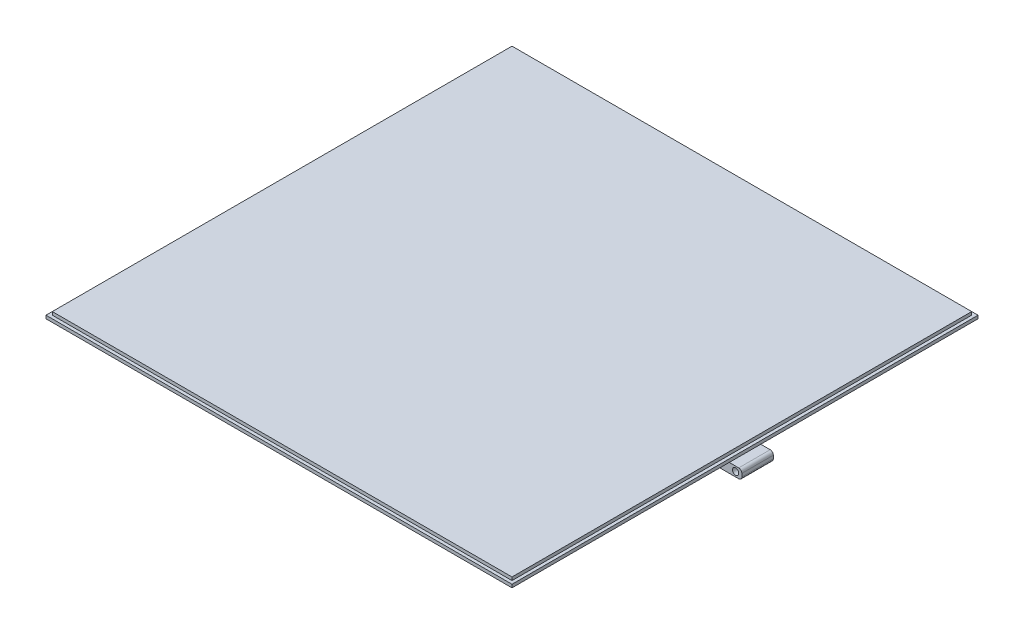
ISO-10303-21;
HEADER;
FILE_DESCRIPTION(('STEP AP214'),'2;1');
FILE_NAME('part.step','',(''),(''),'','','');
FILE_SCHEMA(('AUTOMOTIVE_DESIGN { 1 0 10303 214 1 1 1 1 }'));
ENDSEC;
DATA;
#1=APPLICATION_CONTEXT('core data for automotive mechanical design processes');
#2=APPLICATION_PROTOCOL_DEFINITION('international standard','automotive_design',2000,#1);
#3=PRODUCT_CONTEXT('',#1,'mechanical');
#4=PRODUCT('Part','Part','',(#3));
#5=PRODUCT_RELATED_PRODUCT_CATEGORY('part','',(#4));
#6=PRODUCT_DEFINITION_FORMATION('','',#4);
#7=PRODUCT_DEFINITION_CONTEXT('part definition',#1,'design');
#8=PRODUCT_DEFINITION('design','',#6,#7);
#9=PRODUCT_DEFINITION_SHAPE('','',#8);
#10=(LENGTH_UNIT() NAMED_UNIT(*) SI_UNIT(.MILLI.,.METRE.));
#11=(NAMED_UNIT(*) PLANE_ANGLE_UNIT() SI_UNIT($,.RADIAN.));
#12=(NAMED_UNIT(*) SI_UNIT($,.STERADIAN.) SOLID_ANGLE_UNIT());
#13=UNCERTAINTY_MEASURE_WITH_UNIT(LENGTH_MEASURE(1.E-05),#10,'distance_accuracy_value','');
#14=(GEOMETRIC_REPRESENTATION_CONTEXT(3) GLOBAL_UNCERTAINTY_ASSIGNED_CONTEXT((#13)) GLOBAL_UNIT_ASSIGNED_CONTEXT((#10,
#11,#12)) REPRESENTATION_CONTEXT('',''));
#15=CARTESIAN_POINT('',(0.,0.,0.));
#16=DIRECTION('',(0.,0.,1.));
#17=DIRECTION('',(1.,0.,0.));
#18=AXIS2_PLACEMENT_3D('',#15,#16,#17);
#19=CARTESIAN_POINT('',(0.,26.,0.));
#20=DIRECTION('',(0.,-1.,0.));
#21=DIRECTION('',(0.,0.,-1.));
#22=AXIS2_PLACEMENT_3D('',#19,#20,#21);
#23=PLANE('',#22);
#24=DIRECTION('',(0.,0.,-1.));
#25=VECTOR('',#24,1.);
#26=CARTESIAN_POINT('',(-74.,26.,74.));
#27=LINE('',#26,#25);
#28=CARTESIAN_POINT('',(-74.,26.,74.));
#29=VERTEX_POINT('',#28);
#30=CARTESIAN_POINT('',(-74.,26.,-74.));
#31=VERTEX_POINT('',#30);
#32=EDGE_CURVE('E198',#29,#31,#27,.T.);
#33=ORIENTED_EDGE('',*,*,#32,.F.);
#34=DIRECTION('',(-1.,0.,0.));
#35=VECTOR('',#34,1.);
#36=CARTESIAN_POINT('',(-74.,26.,74.));
#37=LINE('',#36,#35);
#38=CARTESIAN_POINT('',(74.,26.,74.));
#39=VERTEX_POINT('',#38);
#40=EDGE_CURVE('E208',#39,#29,#37,.T.);
#41=ORIENTED_EDGE('',*,*,#40,.F.);
#42=DIRECTION('',(0.,0.,1.));
#43=VECTOR('',#42,1.);
#44=CARTESIAN_POINT('',(74.,26.,74.));
#45=LINE('',#44,#43);
#46=CARTESIAN_POINT('',(74.,26.,-74.));
#47=VERTEX_POINT('',#46);
#48=EDGE_CURVE('E205',#47,#39,#45,.T.);
#49=ORIENTED_EDGE('',*,*,#48,.F.);
#50=DIRECTION('',(1.,0.,0.));
#51=VECTOR('',#50,1.);
#52=CARTESIAN_POINT('',(-74.,26.,-74.));
#53=LINE('',#52,#51);
#54=EDGE_CURVE('E201',#31,#47,#53,.T.);
#55=ORIENTED_EDGE('',*,*,#54,.F.);
#56=EDGE_LOOP('',(#33,#41,#49,#55));
#57=FACE_BOUND('',#56,.T.);
#58=DIRECTION('',(-1.,0.,0.));
#59=VECTOR('',#58,1.);
#60=CARTESIAN_POINT('',(73.,26.,73.));
#61=LINE('',#60,#59);
#62=CARTESIAN_POINT('',(73.,26.,73.));
#63=VERTEX_POINT('',#62);
#64=CARTESIAN_POINT('',(-73.,26.,73.));
#65=VERTEX_POINT('',#64);
#66=EDGE_CURVE('E232',#63,#65,#61,.T.);
#67=ORIENTED_EDGE('',*,*,#66,.T.);
#68=DIRECTION('',(0.,0.,-1.));
#69=VECTOR('',#68,1.);
#70=CARTESIAN_POINT('',(-73.,26.,73.));
#71=LINE('',#70,#69);
#72=CARTESIAN_POINT('',(-73.,26.,-73.));
#73=VERTEX_POINT('',#72);
#74=EDGE_CURVE('E235',#65,#73,#71,.T.);
#75=ORIENTED_EDGE('',*,*,#74,.T.);
#76=DIRECTION('',(1.,0.,0.));
#77=VECTOR('',#76,1.);
#78=CARTESIAN_POINT('',(73.,26.,-73.));
#79=LINE('',#78,#77);
#80=CARTESIAN_POINT('',(73.,26.,-73.));
#81=VERTEX_POINT('',#80);
#82=EDGE_CURVE('E258',#73,#81,#79,.T.);
#83=ORIENTED_EDGE('',*,*,#82,.T.);
#84=DIRECTION('',(0.,0.,1.));
#85=VECTOR('',#84,1.);
#86=CARTESIAN_POINT('',(73.,26.,73.));
#87=LINE('',#86,#85);
#88=EDGE_CURVE('E223',#81,#63,#87,.T.);
#89=ORIENTED_EDGE('',*,*,#88,.T.);
#90=EDGE_LOOP('',(#67,#75,#83,#89));
#91=FACE_BOUND('',#90,.T.);
#92=ADVANCED_FACE('F57',(#57,#91),#23,.F.);
#93=CARTESIAN_POINT('',(-74.,26.,74.));
#94=DIRECTION('',(-1.,0.,0.));
#95=DIRECTION('',(0.,0.,1.));
#96=AXIS2_PLACEMENT_3D('',#93,#94,#95);
#97=PLANE('',#96);
#98=DIRECTION('',(0.,0.,-1.));
#99=VECTOR('',#98,1.);
#100=CARTESIAN_POINT('',(-74.,25.,74.));
#101=LINE('',#100,#99);
#102=CARTESIAN_POINT('',(-74.,25.,74.));
#103=VERTEX_POINT('',#102);
#104=CARTESIAN_POINT('',(-74.,25.,-74.));
#105=VERTEX_POINT('',#104);
#106=EDGE_CURVE('E188',#103,#105,#101,.T.);
#107=ORIENTED_EDGE('',*,*,#106,.F.);
#108=DIRECTION('',(0.,-1.,0.));
#109=VECTOR('',#108,1.);
#110=CARTESIAN_POINT('',(-74.,26.,74.));
#111=LINE('',#110,#109);
#112=EDGE_CURVE('E221',#29,#103,#111,.T.);
#113=ORIENTED_EDGE('',*,*,#112,.F.);
#114=ORIENTED_EDGE('',*,*,#32,.T.);
#115=DIRECTION('',(0.,-1.,0.));
#116=VECTOR('',#115,1.);
#117=CARTESIAN_POINT('',(-74.,26.,-74.));
#118=LINE('',#117,#116);
#119=EDGE_CURVE('E210',#31,#105,#118,.T.);
#120=ORIENTED_EDGE('',*,*,#119,.T.);
#121=EDGE_LOOP('',(#107,#113,#114,#120));
#122=FACE_BOUND('',#121,.T.);
#123=ADVANCED_FACE('F314',(#122),#97,.T.);
#124=CARTESIAN_POINT('',(-74.,26.,74.));
#125=DIRECTION('',(0.,0.,1.));
#126=DIRECTION('',(1.,0.,0.));
#127=AXIS2_PLACEMENT_3D('',#124,#125,#126);
#128=PLANE('',#127);
#129=DIRECTION('',(-1.,0.,0.));
#130=VECTOR('',#129,1.);
#131=CARTESIAN_POINT('',(-74.,25.,74.));
#132=LINE('',#131,#130);
#133=CARTESIAN_POINT('',(74.,25.,74.));
#134=VERTEX_POINT('',#133);
#135=EDGE_CURVE('E202',#134,#103,#132,.T.);
#136=ORIENTED_EDGE('',*,*,#135,.F.);
#137=DIRECTION('',(0.,-1.,0.));
#138=VECTOR('',#137,1.);
#139=CARTESIAN_POINT('',(74.,26.,74.));
#140=LINE('',#139,#138);
#141=EDGE_CURVE('E224',#39,#134,#140,.T.);
#142=ORIENTED_EDGE('',*,*,#141,.F.);
#143=ORIENTED_EDGE('',*,*,#40,.T.);
#144=ORIENTED_EDGE('',*,*,#112,.T.);
#145=EDGE_LOOP('',(#136,#142,#143,#144));
#146=FACE_BOUND('',#145,.T.);
#147=ADVANCED_FACE('F320',(#146),#128,.T.);
#148=CARTESIAN_POINT('',(74.,26.,74.));
#149=DIRECTION('',(1.,0.,0.));
#150=DIRECTION('',(0.,0.,-1.));
#151=AXIS2_PLACEMENT_3D('',#148,#149,#150);
#152=PLANE('',#151);
#153=DIRECTION('',(0.,0.,1.));
#154=VECTOR('',#153,1.);
#155=CARTESIAN_POINT('',(74.,25.,74.));
#156=LINE('',#155,#154);
#157=CARTESIAN_POINT('',(74.,25.,-74.));
#158=VERTEX_POINT('',#157);
#159=CARTESIAN_POINT('',(74.,25.,-5.));
#160=VERTEX_POINT('',#159);
#161=EDGE_CURVE('E215',#158,#160,#156,.T.);
#162=ORIENTED_EDGE('',*,*,#161,.F.);
#163=DIRECTION('',(0.,-1.,0.));
#164=VECTOR('',#163,1.);
#165=CARTESIAN_POINT('',(74.,26.,-74.));
#166=LINE('',#165,#164);
#167=EDGE_CURVE('E227',#47,#158,#166,.T.);
#168=ORIENTED_EDGE('',*,*,#167,.F.);
#169=ORIENTED_EDGE('',*,*,#48,.T.);
#170=ORIENTED_EDGE('',*,*,#141,.T.);
#171=CARTESIAN_POINT('',(74.,25.,5.));
#172=VERTEX_POINT('',#171);
#173=EDGE_CURVE('E214',#172,#134,#156,.T.);
#174=ORIENTED_EDGE('',*,*,#173,.F.);
#175=EDGE_CURVE('E218',#160,#172,#156,.T.);
#176=ORIENTED_EDGE('',*,*,#175,.F.);
#177=EDGE_LOOP('',(#162,#168,#169,#170,#174,#176));
#178=FACE_BOUND('',#177,.T.);
#179=ADVANCED_FACE('F330',(#178),#152,.T.);
#180=CARTESIAN_POINT('',(-74.,26.,-74.));
#181=DIRECTION('',(0.,0.,-1.));
#182=DIRECTION('',(-1.,0.,0.));
#183=AXIS2_PLACEMENT_3D('',#180,#181,#182);
#184=PLANE('',#183);
#185=DIRECTION('',(1.,0.,0.));
#186=VECTOR('',#185,1.);
#187=CARTESIAN_POINT('',(-74.,25.,-74.));
#188=LINE('',#187,#186);
#189=EDGE_CURVE('E192',#105,#158,#188,.T.);
#190=ORIENTED_EDGE('',*,*,#189,.F.);
#191=ORIENTED_EDGE('',*,*,#119,.F.);
#192=ORIENTED_EDGE('',*,*,#54,.T.);
#193=ORIENTED_EDGE('',*,*,#167,.T.);
#194=EDGE_LOOP('',(#190,#191,#192,#193));
#195=FACE_BOUND('',#194,.T.);
#196=ADVANCED_FACE('F334',(#195),#184,.T.);
#197=CARTESIAN_POINT('',(0.,27.,0.));
#198=DIRECTION('',(0.,1.,0.));
#199=DIRECTION('',(0.,0.,1.));
#200=AXIS2_PLACEMENT_3D('',#197,#198,#199);
#201=PLANE('',#200);
#202=DIRECTION('',(0.,0.,1.));
#203=VECTOR('',#202,1.);
#204=CARTESIAN_POINT('',(-73.,27.,73.));
#205=LINE('',#204,#203);
#206=CARTESIAN_POINT('',(-73.,27.,-73.));
#207=VERTEX_POINT('',#206);
#208=CARTESIAN_POINT('',(-73.,27.,73.));
#209=VERTEX_POINT('',#208);
#210=EDGE_CURVE('E238',#207,#209,#205,.T.);
#211=ORIENTED_EDGE('',*,*,#210,.T.);
#212=DIRECTION('',(1.,0.,0.));
#213=VECTOR('',#212,1.);
#214=CARTESIAN_POINT('',(73.,27.,73.));
#215=LINE('',#214,#213);
#216=CARTESIAN_POINT('',(73.,27.,73.));
#217=VERTEX_POINT('',#216);
#218=EDGE_CURVE('E241',#209,#217,#215,.T.);
#219=ORIENTED_EDGE('',*,*,#218,.T.);
#220=DIRECTION('',(0.,0.,-1.));
#221=VECTOR('',#220,1.);
#222=CARTESIAN_POINT('',(73.,27.,73.));
#223=LINE('',#222,#221);
#224=CARTESIAN_POINT('',(73.,27.,-73.));
#225=VERTEX_POINT('',#224);
#226=EDGE_CURVE('E243',#217,#225,#223,.T.);
#227=ORIENTED_EDGE('',*,*,#226,.T.);
#228=DIRECTION('',(-1.,0.,0.));
#229=VECTOR('',#228,1.);
#230=CARTESIAN_POINT('',(73.,27.,-73.));
#231=LINE('',#230,#229);
#232=EDGE_CURVE('E245',#225,#207,#231,.T.);
#233=ORIENTED_EDGE('',*,*,#232,.T.);
#234=EDGE_LOOP('',(#211,#219,#227,#233));
#235=FACE_BOUND('',#234,.T.);
#236=ADVANCED_FACE('F337',(#235),#201,.T.);
#237=CARTESIAN_POINT('',(73.,27.,-73.));
#238=DIRECTION('',(0.,0.,1.));
#239=DIRECTION('',(1.,0.,0.));
#240=AXIS2_PLACEMENT_3D('',#237,#238,#239);
#241=PLANE('',#240);
#242=ORIENTED_EDGE('',*,*,#82,.F.);
#243=DIRECTION('',(0.,-1.,0.));
#244=VECTOR('',#243,1.);
#245=CARTESIAN_POINT('',(-73.,27.,-73.));
#246=LINE('',#245,#244);
#247=EDGE_CURVE('E247',#207,#73,#246,.T.);
#248=ORIENTED_EDGE('',*,*,#247,.F.);
#249=ORIENTED_EDGE('',*,*,#232,.F.);
#250=DIRECTION('',(0.,-1.,0.));
#251=VECTOR('',#250,1.);
#252=CARTESIAN_POINT('',(73.,27.,-73.));
#253=LINE('',#252,#251);
#254=EDGE_CURVE('E250',#225,#81,#253,.T.);
#255=ORIENTED_EDGE('',*,*,#254,.T.);
#256=EDGE_LOOP('',(#242,#248,#249,#255));
#257=FACE_BOUND('',#256,.T.);
#258=ADVANCED_FACE('F342',(#257),#241,.F.);
#259=CARTESIAN_POINT('',(73.,27.,73.));
#260=DIRECTION('',(-1.,0.,0.));
#261=DIRECTION('',(0.,0.,1.));
#262=AXIS2_PLACEMENT_3D('',#259,#260,#261);
#263=PLANE('',#262);
#264=ORIENTED_EDGE('',*,*,#88,.F.);
#265=ORIENTED_EDGE('',*,*,#254,.F.);
#266=ORIENTED_EDGE('',*,*,#226,.F.);
#267=DIRECTION('',(0.,-1.,0.));
#268=VECTOR('',#267,1.);
#269=CARTESIAN_POINT('',(73.,27.,73.));
#270=LINE('',#269,#268);
#271=EDGE_CURVE('E252',#217,#63,#270,.T.);
#272=ORIENTED_EDGE('',*,*,#271,.T.);
#273=EDGE_LOOP('',(#264,#265,#266,#272));
#274=FACE_BOUND('',#273,.T.);
#275=ADVANCED_FACE('F349',(#274),#263,.F.);
#276=CARTESIAN_POINT('',(73.,27.,73.));
#277=DIRECTION('',(0.,0.,-1.));
#278=DIRECTION('',(-1.,0.,0.));
#279=AXIS2_PLACEMENT_3D('',#276,#277,#278);
#280=PLANE('',#279);
#281=ORIENTED_EDGE('',*,*,#66,.F.);
#282=ORIENTED_EDGE('',*,*,#271,.F.);
#283=ORIENTED_EDGE('',*,*,#218,.F.);
#284=DIRECTION('',(0.,-1.,0.));
#285=VECTOR('',#284,1.);
#286=CARTESIAN_POINT('',(-73.,27.,73.));
#287=LINE('',#286,#285);
#288=EDGE_CURVE('E255',#209,#65,#287,.T.);
#289=ORIENTED_EDGE('',*,*,#288,.T.);
#290=EDGE_LOOP('',(#281,#282,#283,#289));
#291=FACE_BOUND('',#290,.T.);
#292=ADVANCED_FACE('F353',(#291),#280,.F.);
#293=CARTESIAN_POINT('',(-73.,27.,73.));
#294=DIRECTION('',(1.,0.,0.));
#295=DIRECTION('',(0.,0.,-1.));
#296=AXIS2_PLACEMENT_3D('',#293,#294,#295);
#297=PLANE('',#296);
#298=ORIENTED_EDGE('',*,*,#74,.F.);
#299=ORIENTED_EDGE('',*,*,#288,.F.);
#300=ORIENTED_EDGE('',*,*,#210,.F.);
#301=ORIENTED_EDGE('',*,*,#247,.T.);
#302=EDGE_LOOP('',(#298,#299,#300,#301));
#303=FACE_BOUND('',#302,.T.);
#304=ADVANCED_FACE('F357',(#303),#297,.F.);
#305=CARTESIAN_POINT('',(0.,0.,5.));
#306=DIRECTION('',(0.,0.,1.));
#307=DIRECTION('',(1.,0.,0.));
#308=AXIS2_PLACEMENT_3D('',#305,#306,#307);
#309=PLANE('',#308);
#310=DIRECTION('',(1.,0.,0.));
#311=VECTOR('',#310,1.);
#312=CARTESIAN_POINT('',(68.,22.,5.));
#313=LINE('',#312,#311);
#314=CARTESIAN_POINT('',(68.,22.,5.));
#315=VERTEX_POINT('',#314);
#316=CARTESIAN_POINT('',(77.,22.,5.));
#317=VERTEX_POINT('',#316);
#318=EDGE_CURVE('E168',#315,#317,#313,.T.);
#319=ORIENTED_EDGE('',*,*,#318,.T.);
#320=CARTESIAN_POINT('',(77.,23.,5.));
#321=DIRECTION('',(0.,0.,1.));
#322=DIRECTION('',(1.,0.,0.));
#323=AXIS2_PLACEMENT_3D('',#320,#321,#322);
#324=CIRCLE('',#323,1.);
#325=CARTESIAN_POINT('',(78.,23.,5.));
#326=VERTEX_POINT('',#325);
#327=EDGE_CURVE('E65',#317,#326,#324,.T.);
#328=ORIENTED_EDGE('',*,*,#327,.T.);
#329=DIRECTION('',(0.,1.,0.));
#330=VECTOR('',#329,1.);
#331=CARTESIAN_POINT('',(78.,25.,5.));
#332=LINE('',#331,#330);
#333=CARTESIAN_POINT('',(78.,24.,5.));
#334=VERTEX_POINT('',#333);
#335=EDGE_CURVE('E182',#326,#334,#332,.T.);
#336=ORIENTED_EDGE('',*,*,#335,.T.);
#337=CARTESIAN_POINT('',(77.,24.,5.));
#338=DIRECTION('',(0.,0.,1.));
#339=DIRECTION('',(1.,0.,0.));
#340=AXIS2_PLACEMENT_3D('',#337,#338,#339);
#341=CIRCLE('',#340,1.);
#342=CARTESIAN_POINT('',(77.,25.,5.));
#343=VERTEX_POINT('',#342);
#344=EDGE_CURVE('E72',#334,#343,#341,.T.);
#345=ORIENTED_EDGE('',*,*,#344,.T.);
#346=DIRECTION('',(-1.,0.,0.));
#347=VECTOR('',#346,1.);
#348=CARTESIAN_POINT('',(68.,25.,5.));
#349=LINE('',#348,#347);
#350=EDGE_CURVE('E189',#343,#172,#349,.T.);
#351=ORIENTED_EDGE('',*,*,#350,.T.);
#352=CARTESIAN_POINT('',(65.,25.,5.));
#353=VERTEX_POINT('',#352);
#354=EDGE_CURVE('E171',#172,#353,#349,.T.);
#355=ORIENTED_EDGE('',*,*,#354,.T.);
#356=DIRECTION('',(-0.707106781186544,0.707106781186551,0.));
#357=VECTOR('',#356,1.);
#358=CARTESIAN_POINT('',(68.,22.,5.));
#359=LINE('',#358,#357);
#360=EDGE_CURVE('E165',#353,#315,#359,.F.);
#361=ORIENTED_EDGE('',*,*,#360,.T.);
#362=EDGE_LOOP('',(#319,#328,#336,#345,#351,#355,#361));
#363=FACE_BOUND('',#362,.T.);
#364=CARTESIAN_POINT('',(76.,23.5,5.));
#365=DIRECTION('',(0.,0.,1.));
#366=DIRECTION('',(1.,0.,0.));
#367=AXIS2_PLACEMENT_3D('',#364,#365,#366);
#368=CIRCLE('',#367,0.999999999999998);
#369=CARTESIAN_POINT('',(77.,23.5,5.));
#370=VERTEX_POINT('',#369);
#371=EDGE_CURVE('E288',#370,#370,#368,.T.);
#372=ORIENTED_EDGE('',*,*,#371,.F.);
#373=EDGE_LOOP('',(#372));
#374=FACE_BOUND('',#373,.T.);
#375=ADVANCED_FACE('F166',(#363,#374),#309,.T.);
#376=CARTESIAN_POINT('',(0.,0.,-5.));
#377=DIRECTION('',(0.,0.,1.));
#378=DIRECTION('',(1.,0.,0.));
#379=AXIS2_PLACEMENT_3D('',#376,#377,#378);
#380=PLANE('',#379);
#381=DIRECTION('',(0.,1.,0.));
#382=VECTOR('',#381,1.);
#383=CARTESIAN_POINT('',(78.,25.,-5.));
#384=LINE('',#383,#382);
#385=CARTESIAN_POINT('',(78.,23.,-5.));
#386=VERTEX_POINT('',#385);
#387=CARTESIAN_POINT('',(78.,24.,-5.));
#388=VERTEX_POINT('',#387);
#389=EDGE_CURVE('E287',#386,#388,#384,.T.);
#390=ORIENTED_EDGE('',*,*,#389,.F.);
#391=CARTESIAN_POINT('',(77.,23.,-5.));
#392=DIRECTION('',(0.,0.,1.));
#393=DIRECTION('',(1.,0.,0.));
#394=AXIS2_PLACEMENT_3D('',#391,#392,#393);
#395=CIRCLE('',#394,1.);
#396=CARTESIAN_POINT('',(77.,22.,-5.));
#397=VERTEX_POINT('',#396);
#398=EDGE_CURVE('E270',#386,#397,#395,.F.);
#399=ORIENTED_EDGE('',*,*,#398,.T.);
#400=DIRECTION('',(1.,0.,0.));
#401=VECTOR('',#400,1.);
#402=CARTESIAN_POINT('',(68.,22.,-5.));
#403=LINE('',#402,#401);
#404=CARTESIAN_POINT('',(68.,22.,-5.));
#405=VERTEX_POINT('',#404);
#406=EDGE_CURVE('E286',#405,#397,#403,.T.);
#407=ORIENTED_EDGE('',*,*,#406,.F.);
#408=DIRECTION('',(0.707106781186544,-0.707106781186551,0.));
#409=VECTOR('',#408,1.);
#410=CARTESIAN_POINT('',(45.0000000000003,44.9999999999999,-5.));
#411=LINE('',#410,#409);
#412=CARTESIAN_POINT('',(65.,25.,-5.));
#413=VERTEX_POINT('',#412);
#414=EDGE_CURVE('E177',#405,#413,#411,.F.);
#415=ORIENTED_EDGE('',*,*,#414,.T.);
#416=DIRECTION('',(-1.,0.,0.));
#417=VECTOR('',#416,1.);
#418=CARTESIAN_POINT('',(68.,25.,-5.));
#419=LINE('',#418,#417);
#420=EDGE_CURVE('E290',#160,#413,#419,.T.);
#421=ORIENTED_EDGE('',*,*,#420,.F.);
#422=CARTESIAN_POINT('',(77.,25.,-5.));
#423=VERTEX_POINT('',#422);
#424=EDGE_CURVE('E183',#423,#160,#419,.T.);
#425=ORIENTED_EDGE('',*,*,#424,.F.);
#426=CARTESIAN_POINT('',(77.,24.,-5.));
#427=DIRECTION('',(0.,0.,1.));
#428=DIRECTION('',(1.,0.,0.));
#429=AXIS2_PLACEMENT_3D('',#426,#427,#428);
#430=CIRCLE('',#429,1.);
#431=EDGE_CURVE('E268',#423,#388,#430,.F.);
#432=ORIENTED_EDGE('',*,*,#431,.T.);
#433=EDGE_LOOP('',(#390,#399,#407,#415,#421,#425,#432));
#434=FACE_BOUND('',#433,.T.);
#435=CARTESIAN_POINT('',(76.,23.5,-5.));
#436=DIRECTION('',(0.,0.,1.));
#437=DIRECTION('',(1.,0.,0.));
#438=AXIS2_PLACEMENT_3D('',#435,#436,#437);
#439=CIRCLE('',#438,0.999999999999998);
#440=CARTESIAN_POINT('',(77.,23.5,-5.));
#441=VERTEX_POINT('',#440);
#442=EDGE_CURVE('E292',#441,#441,#439,.T.);
#443=ORIENTED_EDGE('',*,*,#442,.T.);
#444=EDGE_LOOP('',(#443));
#445=FACE_BOUND('',#444,.T.);
#446=ADVANCED_FACE('F284',(#434,#445),#380,.F.);
#447=CARTESIAN_POINT('',(68.,22.,5.));
#448=DIRECTION('',(0.,1.,0.));
#449=DIRECTION('',(-1.,0.,0.));
#450=AXIS2_PLACEMENT_3D('',#447,#448,#449);
#451=PLANE('',#450);
#452=ORIENTED_EDGE('',*,*,#406,.T.);
#453=DIRECTION('',(0.,0.,-1.));
#454=VECTOR('',#453,1.);
#455=CARTESIAN_POINT('',(77.,22.,5.));
#456=LINE('',#455,#454);
#457=EDGE_CURVE('E80',#397,#317,#456,.F.);
#458=ORIENTED_EDGE('',*,*,#457,.T.);
#459=ORIENTED_EDGE('',*,*,#318,.F.);
#460=DIRECTION('',(0.,0.,-1.));
#461=VECTOR('',#460,1.);
#462=CARTESIAN_POINT('',(68.,22.,5.));
#463=LINE('',#462,#461);
#464=EDGE_CURVE('E181',#315,#405,#463,.T.);
#465=ORIENTED_EDGE('',*,*,#464,.T.);
#466=EDGE_LOOP('',(#452,#458,#459,#465));
#467=FACE_BOUND('',#466,.T.);
#468=ADVANCED_FACE('F180',(#467),#451,.F.);
#469=CARTESIAN_POINT('',(78.,25.,5.));
#470=DIRECTION('',(-1.,0.,0.));
#471=DIRECTION('',(0.,-1.,0.));
#472=AXIS2_PLACEMENT_3D('',#469,#470,#471);
#473=PLANE('',#472);
#474=ORIENTED_EDGE('',*,*,#335,.F.);
#475=DIRECTION('',(0.,0.,-1.));
#476=VECTOR('',#475,1.);
#477=CARTESIAN_POINT('',(78.,23.,5.));
#478=LINE('',#477,#476);
#479=EDGE_CURVE('E265',#326,#386,#478,.T.);
#480=ORIENTED_EDGE('',*,*,#479,.T.);
#481=ORIENTED_EDGE('',*,*,#389,.T.);
#482=DIRECTION('',(0.,0.,-1.));
#483=VECTOR('',#482,1.);
#484=CARTESIAN_POINT('',(78.,24.,5.));
#485=LINE('',#484,#483);
#486=EDGE_CURVE('E176',#388,#334,#485,.F.);
#487=ORIENTED_EDGE('',*,*,#486,.T.);
#488=EDGE_LOOP('',(#474,#480,#481,#487));
#489=FACE_BOUND('',#488,.T.);
#490=ADVANCED_FACE('F277',(#489),#473,.F.);
#491=CARTESIAN_POINT('',(68.,25.,5.));
#492=DIRECTION('',(0.,-1.,0.));
#493=DIRECTION('',(0.,0.,-1.));
#494=AXIS2_PLACEMENT_3D('',#491,#492,#493);
#495=PLANE('',#494);
#496=ORIENTED_EDGE('',*,*,#350,.F.);
#497=DIRECTION('',(0.,0.,-1.));
#498=VECTOR('',#497,1.);
#499=CARTESIAN_POINT('',(77.,25.,5.));
#500=LINE('',#499,#498);
#501=EDGE_CURVE('E12',#343,#423,#500,.T.);
#502=ORIENTED_EDGE('',*,*,#501,.T.);
#503=ORIENTED_EDGE('',*,*,#424,.T.);
#504=ORIENTED_EDGE('',*,*,#175,.T.);
#505=EDGE_LOOP('',(#496,#502,#503,#504));
#506=FACE_BOUND('',#505,.T.);
#507=ADVANCED_FACE('F300',(#506),#495,.F.);
#508=CARTESIAN_POINT('',(76.,23.5,5.));
#509=DIRECTION('',(0.,0.,-1.));
#510=DIRECTION('',(-1.,0.,0.));
#511=AXIS2_PLACEMENT_3D('',#508,#509,#510);
#512=CYLINDRICAL_SURFACE('',#511,0.999999999999998);
#513=ORIENTED_EDGE('',*,*,#371,.T.);
#514=EDGE_LOOP('',(#513));
#515=FACE_BOUND('',#514,.T.);
#516=ORIENTED_EDGE('',*,*,#442,.F.);
#517=EDGE_LOOP('',(#516));
#518=FACE_BOUND('',#517,.T.);
#519=ADVANCED_FACE('F298',(#515,#518),#512,.F.);
#520=CARTESIAN_POINT('',(68.,22.,5.));
#521=DIRECTION('',(-0.707106781186551,-0.707106781186544,0.));
#522=DIRECTION('',(0.,0.,1.));
#523=AXIS2_PLACEMENT_3D('',#520,#521,#522);
#524=PLANE('',#523);
#525=ORIENTED_EDGE('',*,*,#360,.F.);
#526=DIRECTION('',(0.,0.,1.));
#527=VECTOR('',#526,1.);
#528=CARTESIAN_POINT('',(65.,25.,5.));
#529=LINE('',#528,#527);
#530=EDGE_CURVE('E261',#413,#353,#529,.T.);
#531=ORIENTED_EDGE('',*,*,#530,.F.);
#532=ORIENTED_EDGE('',*,*,#414,.F.);
#533=ORIENTED_EDGE('',*,*,#464,.F.);
#534=EDGE_LOOP('',(#525,#531,#532,#533));
#535=FACE_BOUND('',#534,.T.);
#536=ADVANCED_FACE('F185',(#535),#524,.T.);
#537=CARTESIAN_POINT('',(0.,25.,0.));
#538=DIRECTION('',(0.,1.,0.));
#539=DIRECTION('',(0.,0.,1.));
#540=AXIS2_PLACEMENT_3D('',#537,#538,#539);
#541=PLANE('',#540);
#542=ORIENTED_EDGE('',*,*,#420,.T.);
#543=ORIENTED_EDGE('',*,*,#530,.T.);
#544=ORIENTED_EDGE('',*,*,#354,.F.);
#545=ORIENTED_EDGE('',*,*,#173,.T.);
#546=ORIENTED_EDGE('',*,*,#135,.T.);
#547=ORIENTED_EDGE('',*,*,#106,.T.);
#548=ORIENTED_EDGE('',*,*,#189,.T.);
#549=ORIENTED_EDGE('',*,*,#161,.T.);
#550=EDGE_LOOP('',(#542,#543,#544,#545,#546,#547,#548,#549));
#551=FACE_BOUND('',#550,.T.);
#552=ADVANCED_FACE('F307',(#551),#541,.F.);
#553=CARTESIAN_POINT('',(77.,23.,5.));
#554=DIRECTION('',(0.,0.,-1.));
#555=DIRECTION('',(-1.,0.,0.));
#556=AXIS2_PLACEMENT_3D('',#553,#554,#555);
#557=CYLINDRICAL_SURFACE('',#556,1.);
#558=ORIENTED_EDGE('',*,*,#327,.F.);
#559=ORIENTED_EDGE('',*,*,#457,.F.);
#560=ORIENTED_EDGE('',*,*,#398,.F.);
#561=ORIENTED_EDGE('',*,*,#479,.F.);
#562=EDGE_LOOP('',(#558,#559,#560,#561));
#563=FACE_BOUND('',#562,.T.);
#564=ADVANCED_FACE('F282',(#563),#557,.T.);
#565=CARTESIAN_POINT('',(77.,24.,5.));
#566=DIRECTION('',(0.,0.,-1.));
#567=DIRECTION('',(-1.,0.,0.));
#568=AXIS2_PLACEMENT_3D('',#565,#566,#567);
#569=CYLINDRICAL_SURFACE('',#568,1.);
#570=ORIENTED_EDGE('',*,*,#344,.F.);
#571=ORIENTED_EDGE('',*,*,#486,.F.);
#572=ORIENTED_EDGE('',*,*,#431,.F.);
#573=ORIENTED_EDGE('',*,*,#501,.F.);
#574=EDGE_LOOP('',(#570,#571,#572,#573));
#575=FACE_BOUND('',#574,.T.);
#576=ADVANCED_FACE('F59',(#575),#569,.T.);
#577=CLOSED_SHELL('',(#92,#123,#147,#179,#196,#236,#258,#275,#292,#304,#375,#446,#468,#490,#507,
#519,#536,#552,#564,#576));
#578=MANIFOLD_SOLID_BREP('B2',#577);
#579=ADVANCED_BREP_SHAPE_REPRESENTATION('',(#18,#578),#14);
#580=SHAPE_DEFINITION_REPRESENTATION(#9,#579);
ENDSEC;
END-ISO-10303-21;
